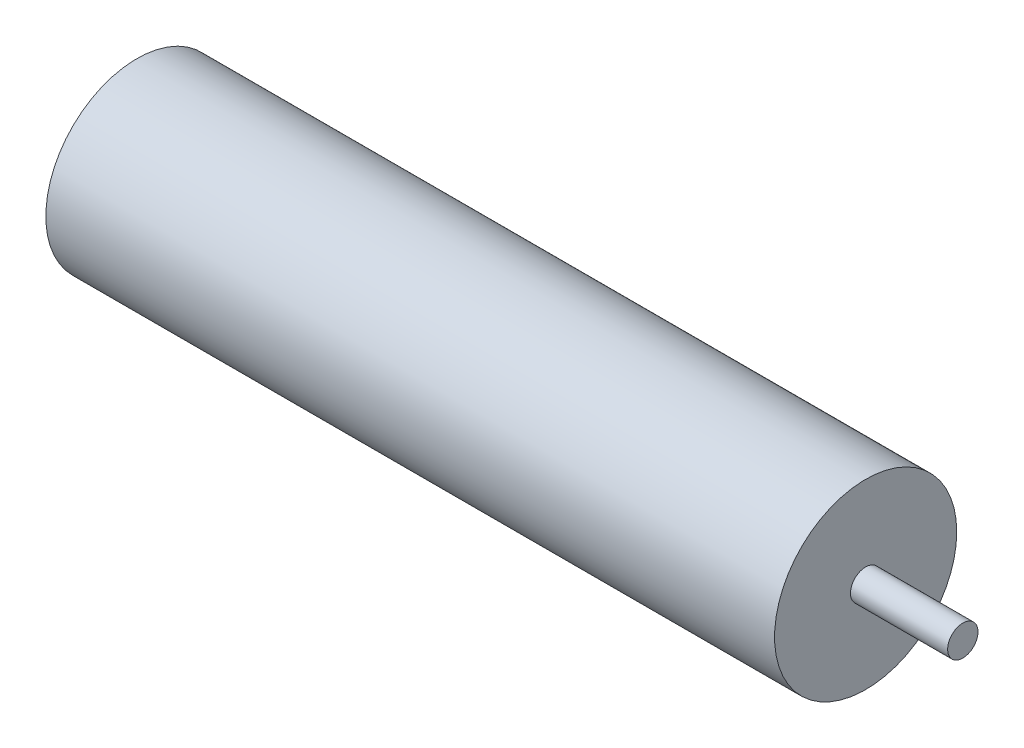
ISO-10303-21;
HEADER;
FILE_DESCRIPTION(('STEP AP214'),'2;1');
FILE_NAME('part.step','',(''),(''),'','','');
FILE_SCHEMA(('AUTOMOTIVE_DESIGN { 1 0 10303 214 1 1 1 1 }'));
ENDSEC;
DATA;
#1=APPLICATION_CONTEXT('core data for automotive mechanical design processes');
#2=APPLICATION_PROTOCOL_DEFINITION('international standard','automotive_design',2000,#1);
#3=PRODUCT_CONTEXT('',#1,'mechanical');
#4=PRODUCT('Part','Part','',(#3));
#5=PRODUCT_RELATED_PRODUCT_CATEGORY('part','',(#4));
#6=PRODUCT_DEFINITION_FORMATION('','',#4);
#7=PRODUCT_DEFINITION_CONTEXT('part definition',#1,'design');
#8=PRODUCT_DEFINITION('design','',#6,#7);
#9=PRODUCT_DEFINITION_SHAPE('','',#8);
#10=(LENGTH_UNIT() NAMED_UNIT(*) SI_UNIT(.MILLI.,.METRE.));
#11=(NAMED_UNIT(*) PLANE_ANGLE_UNIT() SI_UNIT($,.RADIAN.));
#12=(NAMED_UNIT(*) SI_UNIT($,.STERADIAN.) SOLID_ANGLE_UNIT());
#13=UNCERTAINTY_MEASURE_WITH_UNIT(LENGTH_MEASURE(1.E-05),#10,'distance_accuracy_value','');
#14=(GEOMETRIC_REPRESENTATION_CONTEXT(3) GLOBAL_UNCERTAINTY_ASSIGNED_CONTEXT((#13)) GLOBAL_UNIT_ASSIGNED_CONTEXT((#10,
#11,#12)) REPRESENTATION_CONTEXT('',''));
#15=CARTESIAN_POINT('',(0.,0.,0.));
#16=DIRECTION('',(0.,0.,1.));
#17=DIRECTION('',(1.,0.,0.));
#18=AXIS2_PLACEMENT_3D('',#15,#16,#17);
#19=CARTESIAN_POINT('',(120.,0.,0.));
#20=DIRECTION('',(-1.,0.,0.));
#21=DIRECTION('',(0.,0.,1.));
#22=AXIS2_PLACEMENT_3D('',#19,#20,#21);
#23=CYLINDRICAL_SURFACE('',#22,15.);
#24=CARTESIAN_POINT('',(120.,0.,0.));
#25=DIRECTION('',(1.,0.,0.));
#26=DIRECTION('',(0.,0.,-1.));
#27=AXIS2_PLACEMENT_3D('',#24,#25,#26);
#28=CIRCLE('',#27,15.);
#29=CARTESIAN_POINT('',(120.,0.,-15.));
#30=VERTEX_POINT('',#29);
#31=EDGE_CURVE('E42',#30,#30,#28,.T.);
#32=ORIENTED_EDGE('',*,*,#31,.F.);
#33=EDGE_LOOP('',(#32));
#34=FACE_BOUND('',#33,.T.);
#35=CARTESIAN_POINT('',(0.,0.,0.));
#36=DIRECTION('',(1.,0.,0.));
#37=DIRECTION('',(0.,0.,-1.));
#38=AXIS2_PLACEMENT_3D('',#35,#36,#37);
#39=CIRCLE('',#38,15.);
#40=CARTESIAN_POINT('',(0.,0.,-15.));
#41=VERTEX_POINT('',#40);
#42=EDGE_CURVE('E37',#41,#41,#39,.T.);
#43=ORIENTED_EDGE('',*,*,#42,.T.);
#44=EDGE_LOOP('',(#43));
#45=FACE_BOUND('',#44,.T.);
#46=ADVANCED_FACE('F40',(#34,#45),#23,.T.);
#47=CARTESIAN_POINT('',(120.,0.,0.));
#48=DIRECTION('',(1.,0.,0.));
#49=DIRECTION('',(0.,0.,-1.));
#50=AXIS2_PLACEMENT_3D('',#47,#48,#49);
#51=PLANE('',#50);
#52=CARTESIAN_POINT('',(120.,0.,0.));
#53=DIRECTION('',(1.,0.,0.));
#54=DIRECTION('',(0.,0.,-1.));
#55=AXIS2_PLACEMENT_3D('',#52,#53,#54);
#56=CIRCLE('',#55,2.5);
#57=CARTESIAN_POINT('',(120.,0.,-2.5));
#58=VERTEX_POINT('',#57);
#59=EDGE_CURVE('E10',#58,#58,#56,.T.);
#60=ORIENTED_EDGE('',*,*,#59,.F.);
#61=EDGE_LOOP('',(#60));
#62=FACE_BOUND('',#61,.T.);
#63=ORIENTED_EDGE('',*,*,#31,.T.);
#64=EDGE_LOOP('',(#63));
#65=FACE_BOUND('',#64,.T.);
#66=ADVANCED_FACE('F62',(#62,#65),#51,.T.);
#67=CARTESIAN_POINT('',(0.,0.,0.));
#68=DIRECTION('',(1.,0.,0.));
#69=DIRECTION('',(0.,0.,-1.));
#70=AXIS2_PLACEMENT_3D('',#67,#68,#69);
#71=PLANE('',#70);
#72=ORIENTED_EDGE('',*,*,#42,.F.);
#73=EDGE_LOOP('',(#72));
#74=FACE_BOUND('',#73,.T.);
#75=ADVANCED_FACE('F59',(#74),#71,.F.);
#76=CARTESIAN_POINT('',(136.,0.,0.));
#77=DIRECTION('',(-1.,0.,0.));
#78=DIRECTION('',(0.,0.,1.));
#79=AXIS2_PLACEMENT_3D('',#76,#77,#78);
#80=CYLINDRICAL_SURFACE('',#79,2.5);
#81=CARTESIAN_POINT('',(136.,0.,0.));
#82=DIRECTION('',(1.,0.,0.));
#83=DIRECTION('',(0.,0.,-1.));
#84=AXIS2_PLACEMENT_3D('',#81,#82,#83);
#85=CIRCLE('',#84,2.5);
#86=CARTESIAN_POINT('',(136.,0.,-2.5));
#87=VERTEX_POINT('',#86);
#88=EDGE_CURVE('E49',#87,#87,#85,.T.);
#89=ORIENTED_EDGE('',*,*,#88,.F.);
#90=EDGE_LOOP('',(#89));
#91=FACE_BOUND('',#90,.T.);
#92=ORIENTED_EDGE('',*,*,#59,.T.);
#93=EDGE_LOOP('',(#92));
#94=FACE_BOUND('',#93,.T.);
#95=ADVANCED_FACE('F58',(#91,#94),#80,.T.);
#96=CARTESIAN_POINT('',(136.,0.,0.));
#97=DIRECTION('',(1.,0.,0.));
#98=DIRECTION('',(0.,0.,-1.));
#99=AXIS2_PLACEMENT_3D('',#96,#97,#98);
#100=PLANE('',#99);
#101=ORIENTED_EDGE('',*,*,#88,.T.);
#102=EDGE_LOOP('',(#101));
#103=FACE_BOUND('',#102,.T.);
#104=ADVANCED_FACE('F69',(#103),#100,.T.);
#105=CLOSED_SHELL('',(#46,#66,#75,#95,#104));
#106=MANIFOLD_SOLID_BREP('B2',#105);
#107=ADVANCED_BREP_SHAPE_REPRESENTATION('',(#18,#106),#14);
#108=SHAPE_DEFINITION_REPRESENTATION(#9,#107);
ENDSEC;
END-ISO-10303-21;
